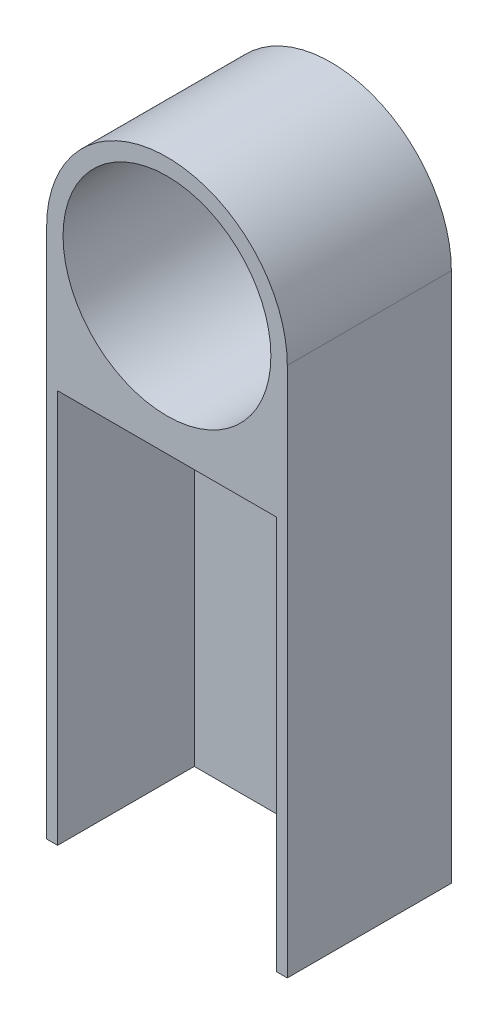
ISO-10303-21;
HEADER;
FILE_DESCRIPTION(('STEP AP214'),'2;1');
FILE_NAME('part.step','',(''),(''),'','','');
FILE_SCHEMA(('AUTOMOTIVE_DESIGN { 1 0 10303 214 1 1 1 1 }'));
ENDSEC;
DATA;
#1=APPLICATION_CONTEXT('core data for automotive mechanical design processes');
#2=APPLICATION_PROTOCOL_DEFINITION('international standard','automotive_design',2000,#1);
#3=PRODUCT_CONTEXT('',#1,'mechanical');
#4=PRODUCT('Part','Part','',(#3));
#5=PRODUCT_RELATED_PRODUCT_CATEGORY('part','',(#4));
#6=PRODUCT_DEFINITION_FORMATION('','',#4);
#7=PRODUCT_DEFINITION_CONTEXT('part definition',#1,'design');
#8=PRODUCT_DEFINITION('design','',#6,#7);
#9=PRODUCT_DEFINITION_SHAPE('','',#8);
#10=(LENGTH_UNIT() NAMED_UNIT(*) SI_UNIT(.MILLI.,.METRE.));
#11=(NAMED_UNIT(*) PLANE_ANGLE_UNIT() SI_UNIT($,.RADIAN.));
#12=(NAMED_UNIT(*) SI_UNIT($,.STERADIAN.) SOLID_ANGLE_UNIT());
#13=UNCERTAINTY_MEASURE_WITH_UNIT(LENGTH_MEASURE(1.E-05),#10,'distance_accuracy_value','');
#14=(GEOMETRIC_REPRESENTATION_CONTEXT(3) GLOBAL_UNCERTAINTY_ASSIGNED_CONTEXT((#13)) GLOBAL_UNIT_ASSIGNED_CONTEXT((#10,
#11,#12)) REPRESENTATION_CONTEXT('',''));
#15=CARTESIAN_POINT('',(0.,0.,0.));
#16=DIRECTION('',(0.,0.,1.));
#17=DIRECTION('',(1.,0.,0.));
#18=AXIS2_PLACEMENT_3D('',#15,#16,#17);
#19=CARTESIAN_POINT('',(0.,0.,30.));
#20=DIRECTION('',(0.,0.,-1.));
#21=DIRECTION('',(-1.,0.,0.));
#22=AXIS2_PLACEMENT_3D('',#19,#20,#21);
#23=CYLINDRICAL_SURFACE('',#22,22.);
#24=CARTESIAN_POINT('',(0.,0.,0.));
#25=DIRECTION('',(0.,0.,1.));
#26=DIRECTION('',(1.,0.,0.));
#27=AXIS2_PLACEMENT_3D('',#24,#25,#26);
#28=CIRCLE('',#27,22.);
#29=CARTESIAN_POINT('',(22.,0.,0.));
#30=VERTEX_POINT('',#29);
#31=CARTESIAN_POINT('',(-22.,0.,0.));
#32=VERTEX_POINT('',#31);
#33=EDGE_CURVE('E180',#30,#32,#28,.T.);
#34=ORIENTED_EDGE('',*,*,#33,.T.);
#35=DIRECTION('',(0.,0.,-1.));
#36=VECTOR('',#35,1.);
#37=CARTESIAN_POINT('',(-22.,0.,30.));
#38=LINE('',#37,#36);
#39=CARTESIAN_POINT('',(-22.,0.,30.));
#40=VERTEX_POINT('',#39);
#41=EDGE_CURVE('E192',#40,#32,#38,.T.);
#42=ORIENTED_EDGE('',*,*,#41,.F.);
#43=CARTESIAN_POINT('',(0.,0.,30.));
#44=DIRECTION('',(0.,0.,1.));
#45=DIRECTION('',(1.,0.,0.));
#46=AXIS2_PLACEMENT_3D('',#43,#44,#45);
#47=CIRCLE('',#46,22.);
#48=CARTESIAN_POINT('',(22.,0.,30.));
#49=VERTEX_POINT('',#48);
#50=EDGE_CURVE('E166',#49,#40,#47,.T.);
#51=ORIENTED_EDGE('',*,*,#50,.F.);
#52=DIRECTION('',(0.,0.,-1.));
#53=VECTOR('',#52,1.);
#54=CARTESIAN_POINT('',(22.,0.,30.));
#55=LINE('',#54,#53);
#56=EDGE_CURVE('E176',#49,#30,#55,.T.);
#57=ORIENTED_EDGE('',*,*,#56,.T.);
#58=EDGE_LOOP('',(#34,#42,#51,#57));
#59=FACE_BOUND('',#58,.T.);
#60=ADVANCED_FACE('F41',(#59),#23,.T.);
#61=CARTESIAN_POINT('',(-22.,0.,30.));
#62=DIRECTION('',(-1.,0.,0.));
#63=DIRECTION('',(0.,-1.,0.));
#64=AXIS2_PLACEMENT_3D('',#61,#62,#63);
#65=PLANE('',#64);
#66=DIRECTION('',(0.,0.,1.));
#67=VECTOR('',#66,1.);
#68=CARTESIAN_POINT('',(-22.,-97.,0.));
#69=LINE('',#68,#67);
#70=CARTESIAN_POINT('',(-22.,-97.,0.));
#71=VERTEX_POINT('',#70);
#72=CARTESIAN_POINT('',(-22.,-97.,30.));
#73=VERTEX_POINT('',#72);
#74=EDGE_CURVE('E65',#71,#73,#69,.T.);
#75=ORIENTED_EDGE('',*,*,#74,.T.);
#76=DIRECTION('',(0.,1.,0.));
#77=VECTOR('',#76,1.);
#78=CARTESIAN_POINT('',(-22.,0.,30.));
#79=LINE('',#78,#77);
#80=EDGE_CURVE('E127',#73,#40,#79,.T.);
#81=ORIENTED_EDGE('',*,*,#80,.T.);
#82=ORIENTED_EDGE('',*,*,#41,.T.);
#83=DIRECTION('',(0.,1.,0.));
#84=VECTOR('',#83,1.);
#85=CARTESIAN_POINT('',(-22.,0.,0.));
#86=LINE('',#85,#84);
#87=EDGE_CURVE('E184',#71,#32,#86,.T.);
#88=ORIENTED_EDGE('',*,*,#87,.F.);
#89=EDGE_LOOP('',(#75,#81,#82,#88));
#90=FACE_BOUND('',#89,.T.);
#91=ADVANCED_FACE('F207',(#90),#65,.T.);
#92=CARTESIAN_POINT('',(0.,0.,30.));
#93=DIRECTION('',(0.,0.,-1.));
#94=DIRECTION('',(-1.,0.,0.));
#95=AXIS2_PLACEMENT_3D('',#92,#93,#94);
#96=CYLINDRICAL_SURFACE('',#95,19.);
#97=CARTESIAN_POINT('',(0.,0.,30.));
#98=DIRECTION('',(0.,0.,1.));
#99=DIRECTION('',(1.,0.,0.));
#100=AXIS2_PLACEMENT_3D('',#97,#98,#99);
#101=CIRCLE('',#100,19.);
#102=CARTESIAN_POINT('',(19.,0.,30.));
#103=VERTEX_POINT('',#102);
#104=EDGE_CURVE('E162',#103,#103,#101,.T.);
#105=ORIENTED_EDGE('',*,*,#104,.T.);
#106=EDGE_LOOP('',(#105));
#107=FACE_BOUND('',#106,.T.);
#108=CARTESIAN_POINT('',(0.,0.,0.));
#109=DIRECTION('',(0.,0.,1.));
#110=DIRECTION('',(1.,0.,0.));
#111=AXIS2_PLACEMENT_3D('',#108,#109,#110);
#112=CIRCLE('',#111,19.);
#113=CARTESIAN_POINT('',(19.,0.,0.));
#114=VERTEX_POINT('',#113);
#115=EDGE_CURVE('E158',#114,#114,#112,.T.);
#116=ORIENTED_EDGE('',*,*,#115,.F.);
#117=EDGE_LOOP('',(#116));
#118=FACE_BOUND('',#117,.T.);
#119=ADVANCED_FACE('F43',(#107,#118),#96,.F.);
#120=CARTESIAN_POINT('',(22.,0.,30.));
#121=DIRECTION('',(1.,0.,0.));
#122=DIRECTION('',(0.,1.,0.));
#123=AXIS2_PLACEMENT_3D('',#120,#121,#122);
#124=PLANE('',#123);
#125=DIRECTION('',(0.,0.,1.));
#126=VECTOR('',#125,1.);
#127=CARTESIAN_POINT('',(22.,-97.,0.));
#128=LINE('',#127,#126);
#129=CARTESIAN_POINT('',(22.,-97.,0.));
#130=VERTEX_POINT('',#129);
#131=CARTESIAN_POINT('',(22.,-97.,30.));
#132=VERTEX_POINT('',#131);
#133=EDGE_CURVE('E139',#130,#132,#128,.T.);
#134=ORIENTED_EDGE('',*,*,#133,.F.);
#135=DIRECTION('',(0.,-1.,0.));
#136=VECTOR('',#135,1.);
#137=CARTESIAN_POINT('',(22.,0.,0.));
#138=LINE('',#137,#136);
#139=EDGE_CURVE('E167',#30,#130,#138,.T.);
#140=ORIENTED_EDGE('',*,*,#139,.F.);
#141=ORIENTED_EDGE('',*,*,#56,.F.);
#142=DIRECTION('',(0.,-1.,0.));
#143=VECTOR('',#142,1.);
#144=CARTESIAN_POINT('',(22.,0.,30.));
#145=LINE('',#144,#143);
#146=EDGE_CURVE('E172',#49,#132,#145,.T.);
#147=ORIENTED_EDGE('',*,*,#146,.T.);
#148=EDGE_LOOP('',(#134,#140,#141,#147));
#149=FACE_BOUND('',#148,.T.);
#150=ADVANCED_FACE('F212',(#149),#124,.T.);
#151=CARTESIAN_POINT('',(0.,0.,30.));
#152=DIRECTION('',(0.,0.,1.));
#153=DIRECTION('',(1.,0.,0.));
#154=AXIS2_PLACEMENT_3D('',#151,#152,#153);
#155=PLANE('',#154);
#156=DIRECTION('',(-1.,0.,0.));
#157=VECTOR('',#156,1.);
#158=CARTESIAN_POINT('',(-22.,-97.,30.));
#159=LINE('',#158,#157);
#160=CARTESIAN_POINT('',(-20.,-97.,30.));
#161=VERTEX_POINT('',#160);
#162=EDGE_CURVE('E121',#161,#73,#159,.T.);
#163=ORIENTED_EDGE('',*,*,#162,.F.);
#164=DIRECTION('',(0.,-1.,0.));
#165=VECTOR('',#164,1.);
#166=CARTESIAN_POINT('',(-20.,-95.,30.));
#167=LINE('',#166,#165);
#168=CARTESIAN_POINT('',(-20.,-25.,30.));
#169=VERTEX_POINT('',#168);
#170=EDGE_CURVE('E108',#169,#161,#167,.T.);
#171=ORIENTED_EDGE('',*,*,#170,.F.);
#172=DIRECTION('',(-1.,0.,0.));
#173=VECTOR('',#172,1.);
#174=CARTESIAN_POINT('',(-20.,-25.,30.));
#175=LINE('',#174,#173);
#176=CARTESIAN_POINT('',(20.,-25.,30.));
#177=VERTEX_POINT('',#176);
#178=EDGE_CURVE('E118',#177,#169,#175,.T.);
#179=ORIENTED_EDGE('',*,*,#178,.F.);
#180=DIRECTION('',(0.,1.,0.));
#181=VECTOR('',#180,1.);
#182=CARTESIAN_POINT('',(20.,-25.,30.));
#183=LINE('',#182,#181);
#184=CARTESIAN_POINT('',(20.,-97.,30.));
#185=VERTEX_POINT('',#184);
#186=EDGE_CURVE('E138',#185,#177,#183,.T.);
#187=ORIENTED_EDGE('',*,*,#186,.F.);
#188=EDGE_CURVE('E129',#132,#185,#159,.T.);
#189=ORIENTED_EDGE('',*,*,#188,.F.);
#190=ORIENTED_EDGE('',*,*,#146,.F.);
#191=ORIENTED_EDGE('',*,*,#50,.T.);
#192=ORIENTED_EDGE('',*,*,#80,.F.);
#193=EDGE_LOOP('',(#163,#171,#179,#187,#189,#190,#191,#192));
#194=FACE_BOUND('',#193,.T.);
#195=ORIENTED_EDGE('',*,*,#104,.F.);
#196=EDGE_LOOP('',(#195));
#197=FACE_BOUND('',#196,.T.);
#198=ADVANCED_FACE('F124',(#194,#197),#155,.T.);
#199=CARTESIAN_POINT('',(0.,0.,0.));
#200=DIRECTION('',(0.,0.,1.));
#201=DIRECTION('',(1.,0.,0.));
#202=AXIS2_PLACEMENT_3D('',#199,#200,#201);
#203=PLANE('',#202);
#204=ORIENTED_EDGE('',*,*,#115,.T.);
#205=EDGE_LOOP('',(#204));
#206=FACE_BOUND('',#205,.T.);
#207=ORIENTED_EDGE('',*,*,#139,.T.);
#208=DIRECTION('',(-1.,0.,0.));
#209=VECTOR('',#208,1.);
#210=CARTESIAN_POINT('',(-22.,-97.,0.));
#211=LINE('',#210,#209);
#212=EDGE_CURVE('E133',#130,#71,#211,.T.);
#213=ORIENTED_EDGE('',*,*,#212,.T.);
#214=ORIENTED_EDGE('',*,*,#87,.T.);
#215=ORIENTED_EDGE('',*,*,#33,.F.);
#216=EDGE_LOOP('',(#207,#213,#214,#215));
#217=FACE_BOUND('',#216,.T.);
#218=ADVANCED_FACE('F202',(#206,#217),#203,.F.);
#219=CARTESIAN_POINT('',(20.,-25.,5.));
#220=DIRECTION('',(1.,0.,0.));
#221=DIRECTION('',(0.,1.,0.));
#222=AXIS2_PLACEMENT_3D('',#219,#220,#221);
#223=PLANE('',#222);
#224=ORIENTED_EDGE('',*,*,#186,.T.);
#225=DIRECTION('',(0.,0.,1.));
#226=VECTOR('',#225,1.);
#227=CARTESIAN_POINT('',(20.,-25.,5.));
#228=LINE('',#227,#226);
#229=CARTESIAN_POINT('',(20.,-25.,5.));
#230=VERTEX_POINT('',#229);
#231=EDGE_CURVE('E151',#230,#177,#228,.T.);
#232=ORIENTED_EDGE('',*,*,#231,.F.);
#233=DIRECTION('',(0.,1.,0.));
#234=VECTOR('',#233,1.);
#235=CARTESIAN_POINT('',(20.,-25.,5.));
#236=LINE('',#235,#234);
#237=CARTESIAN_POINT('',(20.,-97.,5.));
#238=VERTEX_POINT('',#237);
#239=EDGE_CURVE('E57',#238,#230,#236,.T.);
#240=ORIENTED_EDGE('',*,*,#239,.F.);
#241=DIRECTION('',(0.,0.,-1.));
#242=VECTOR('',#241,1.);
#243=CARTESIAN_POINT('',(20.,-97.,0.));
#244=LINE('',#243,#242);
#245=EDGE_CURVE('E196',#185,#238,#244,.T.);
#246=ORIENTED_EDGE('',*,*,#245,.F.);
#247=EDGE_LOOP('',(#224,#232,#240,#246));
#248=FACE_BOUND('',#247,.T.);
#249=ADVANCED_FACE('F215',(#248),#223,.F.);
#250=CARTESIAN_POINT('',(-20.,-95.,5.));
#251=DIRECTION('',(-1.,0.,0.));
#252=DIRECTION('',(0.,0.,1.));
#253=AXIS2_PLACEMENT_3D('',#250,#251,#252);
#254=PLANE('',#253);
#255=ORIENTED_EDGE('',*,*,#170,.T.);
#256=DIRECTION('',(0.,0.,1.));
#257=VECTOR('',#256,1.);
#258=CARTESIAN_POINT('',(-20.,-97.,0.));
#259=LINE('',#258,#257);
#260=CARTESIAN_POINT('',(-20.,-97.,5.));
#261=VERTEX_POINT('',#260);
#262=EDGE_CURVE('E11',#261,#161,#259,.T.);
#263=ORIENTED_EDGE('',*,*,#262,.F.);
#264=DIRECTION('',(0.,-1.,0.));
#265=VECTOR('',#264,1.);
#266=CARTESIAN_POINT('',(-20.,-95.,5.));
#267=LINE('',#266,#265);
#268=CARTESIAN_POINT('',(-20.,-25.,5.));
#269=VERTEX_POINT('',#268);
#270=EDGE_CURVE('E148',#269,#261,#267,.T.);
#271=ORIENTED_EDGE('',*,*,#270,.F.);
#272=DIRECTION('',(0.,0.,1.));
#273=VECTOR('',#272,1.);
#274=CARTESIAN_POINT('',(-20.,-25.,5.));
#275=LINE('',#274,#273);
#276=EDGE_CURVE('E112',#269,#169,#275,.T.);
#277=ORIENTED_EDGE('',*,*,#276,.T.);
#278=EDGE_LOOP('',(#255,#263,#271,#277));
#279=FACE_BOUND('',#278,.T.);
#280=ADVANCED_FACE('F109',(#279),#254,.F.);
#281=CARTESIAN_POINT('',(-20.,-25.,5.));
#282=DIRECTION('',(0.,1.,0.));
#283=DIRECTION('',(-1.,0.,0.));
#284=AXIS2_PLACEMENT_3D('',#281,#282,#283);
#285=PLANE('',#284);
#286=ORIENTED_EDGE('',*,*,#178,.T.);
#287=ORIENTED_EDGE('',*,*,#276,.F.);
#288=DIRECTION('',(-1.,0.,0.));
#289=VECTOR('',#288,1.);
#290=CARTESIAN_POINT('',(-20.,-25.,5.));
#291=LINE('',#290,#289);
#292=EDGE_CURVE('E144',#230,#269,#291,.T.);
#293=ORIENTED_EDGE('',*,*,#292,.F.);
#294=ORIENTED_EDGE('',*,*,#231,.T.);
#295=EDGE_LOOP('',(#286,#287,#293,#294));
#296=FACE_BOUND('',#295,.T.);
#297=ADVANCED_FACE('F222',(#296),#285,.F.);
#298=CARTESIAN_POINT('',(0.,0.,5.));
#299=DIRECTION('',(0.,0.,-1.));
#300=DIRECTION('',(-1.,0.,0.));
#301=AXIS2_PLACEMENT_3D('',#298,#299,#300);
#302=PLANE('',#301);
#303=ORIENTED_EDGE('',*,*,#239,.T.);
#304=ORIENTED_EDGE('',*,*,#292,.T.);
#305=ORIENTED_EDGE('',*,*,#270,.T.);
#306=DIRECTION('',(-1.,0.,0.));
#307=VECTOR('',#306,1.);
#308=CARTESIAN_POINT('',(-22.,-97.,5.));
#309=LINE('',#308,#307);
#310=EDGE_CURVE('E50',#238,#261,#309,.T.);
#311=ORIENTED_EDGE('',*,*,#310,.F.);
#312=EDGE_LOOP('',(#303,#304,#305,#311));
#313=FACE_BOUND('',#312,.T.);
#314=ADVANCED_FACE('F269',(#313),#302,.F.);
#315=CARTESIAN_POINT('',(-22.,-97.,0.));
#316=DIRECTION('',(0.,1.,0.));
#317=DIRECTION('',(0.,0.,1.));
#318=AXIS2_PLACEMENT_3D('',#315,#316,#317);
#319=PLANE('',#318);
#320=ORIENTED_EDGE('',*,*,#310,.T.);
#321=ORIENTED_EDGE('',*,*,#262,.T.);
#322=ORIENTED_EDGE('',*,*,#162,.T.);
#323=ORIENTED_EDGE('',*,*,#74,.F.);
#324=ORIENTED_EDGE('',*,*,#212,.F.);
#325=ORIENTED_EDGE('',*,*,#133,.T.);
#326=ORIENTED_EDGE('',*,*,#188,.T.);
#327=ORIENTED_EDGE('',*,*,#245,.T.);
#328=EDGE_LOOP('',(#320,#321,#322,#323,#324,#325,#326,#327));
#329=FACE_BOUND('',#328,.T.);
#330=ADVANCED_FACE('F120',(#329),#319,.F.);
#331=CLOSED_SHELL('',(#60,#91,#119,#150,#198,#218,#249,#280,#297,#314,#330));
#332=MANIFOLD_SOLID_BREP('B2',#331);
#333=ADVANCED_BREP_SHAPE_REPRESENTATION('',(#18,#332),#14);
#334=SHAPE_DEFINITION_REPRESENTATION(#9,#333);
ENDSEC;
END-ISO-10303-21;
